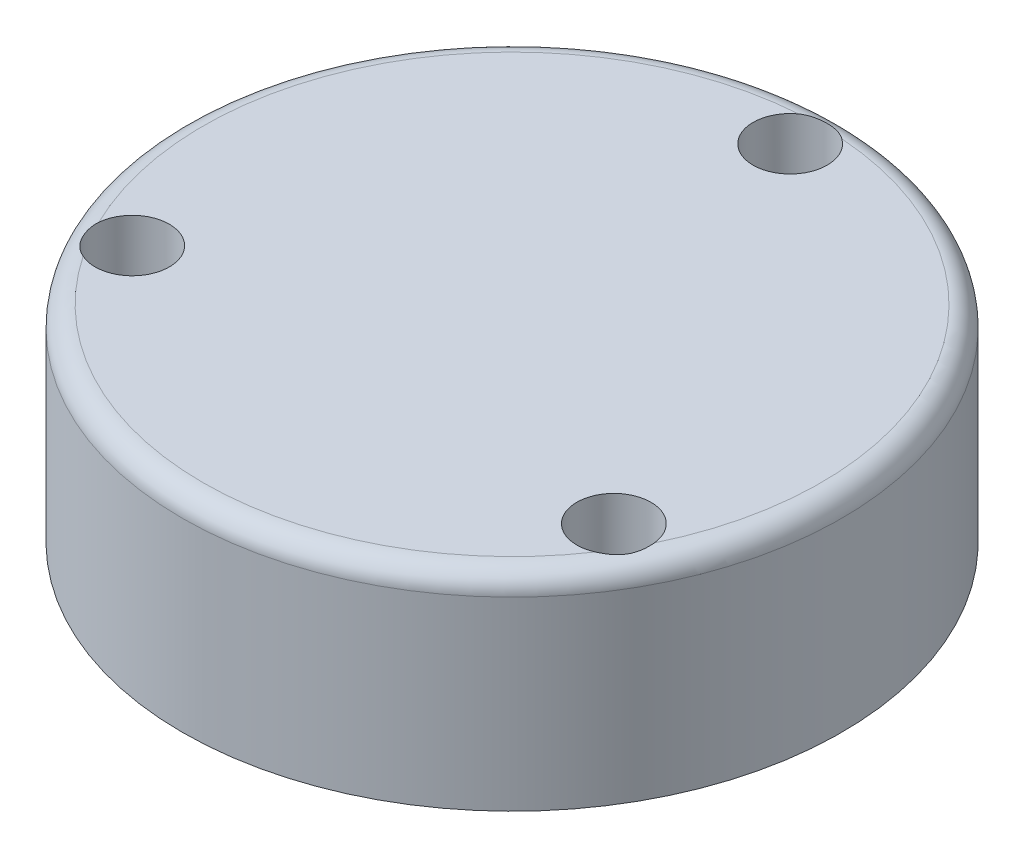
ISO-10303-21;
HEADER;
FILE_DESCRIPTION(('STEP AP214'),'2;1');
FILE_NAME('part.step','',(''),(''),'','','');
FILE_SCHEMA(('AUTOMOTIVE_DESIGN { 1 0 10303 214 1 1 1 1 }'));
ENDSEC;
DATA;
#1=APPLICATION_CONTEXT('core data for automotive mechanical design processes');
#2=APPLICATION_PROTOCOL_DEFINITION('international standard','automotive_design',2000,#1);
#3=PRODUCT_CONTEXT('',#1,'mechanical');
#4=PRODUCT('Part','Part','',(#3));
#5=PRODUCT_RELATED_PRODUCT_CATEGORY('part','',(#4));
#6=PRODUCT_DEFINITION_FORMATION('','',#4);
#7=PRODUCT_DEFINITION_CONTEXT('part definition',#1,'design');
#8=PRODUCT_DEFINITION('design','',#6,#7);
#9=PRODUCT_DEFINITION_SHAPE('','',#8);
#10=(LENGTH_UNIT() NAMED_UNIT(*) SI_UNIT(.MILLI.,.METRE.));
#11=(NAMED_UNIT(*) PLANE_ANGLE_UNIT() SI_UNIT($,.RADIAN.));
#12=(NAMED_UNIT(*) SI_UNIT($,.STERADIAN.) SOLID_ANGLE_UNIT());
#13=UNCERTAINTY_MEASURE_WITH_UNIT(LENGTH_MEASURE(1.E-05),#10,'distance_accuracy_value','');
#14=(GEOMETRIC_REPRESENTATION_CONTEXT(3) GLOBAL_UNCERTAINTY_ASSIGNED_CONTEXT((#13)) GLOBAL_UNIT_ASSIGNED_CONTEXT((#10,
#11,#12)) REPRESENTATION_CONTEXT('',''));
#15=CARTESIAN_POINT('',(0.,0.,0.));
#16=DIRECTION('',(0.,0.,1.));
#17=DIRECTION('',(1.,0.,0.));
#18=AXIS2_PLACEMENT_3D('',#15,#16,#17);
#19=CARTESIAN_POINT('',(0.,10.,0.));
#20=DIRECTION('',(0.,-1.,0.));
#21=DIRECTION('',(0.,0.,-1.));
#22=AXIS2_PLACEMENT_3D('',#19,#20,#21);
#23=CYLINDRICAL_SURFACE('',#22,16.);
#24=CARTESIAN_POINT('',(0.,9.,0.));
#25=DIRECTION('',(0.,1.,0.));
#26=DIRECTION('',(0.,0.,1.));
#27=AXIS2_PLACEMENT_3D('',#24,#25,#26);
#28=CIRCLE('',#27,16.);
#29=CARTESIAN_POINT('',(0.,9.,16.));
#30=VERTEX_POINT('',#29);
#31=EDGE_CURVE('E142',#30,#30,#28,.F.);
#32=ORIENTED_EDGE('',*,*,#31,.T.);
#33=EDGE_LOOP('',(#32));
#34=FACE_BOUND('',#33,.T.);
#35=CARTESIAN_POINT('',(0.,0.,0.));
#36=DIRECTION('',(0.,1.,0.));
#37=DIRECTION('',(0.,0.,1.));
#38=AXIS2_PLACEMENT_3D('',#35,#36,#37);
#39=CIRCLE('',#38,16.);
#40=CARTESIAN_POINT('',(0.,0.,16.));
#41=VERTEX_POINT('',#40);
#42=EDGE_CURVE('E93',#41,#41,#39,.T.);
#43=ORIENTED_EDGE('',*,*,#42,.T.);
#44=EDGE_LOOP('',(#43));
#45=FACE_BOUND('',#44,.T.);
#46=ADVANCED_FACE('F39',(#34,#45),#23,.T.);
#47=CARTESIAN_POINT('',(0.,10.,0.));
#48=DIRECTION('',(0.,1.,0.));
#49=DIRECTION('',(0.,0.,1.));
#50=AXIS2_PLACEMENT_3D('',#47,#48,#49);
#51=PLANE('',#50);
#52=CARTESIAN_POINT('',(11.6913429510908,10.,6.7499999999995));
#53=DIRECTION('',(0.,1.,0.));
#54=DIRECTION('',(0.,0.,1.));
#55=AXIS2_PLACEMENT_3D('',#52,#53,#54);
#56=CIRCLE('',#55,1.8);
#57=CARTESIAN_POINT('',(13.4827106486956,10.,6.57392679937567));
#58=VERTEX_POINT('',#57);
#59=CARTESIAN_POINT('',(12.4345429352275,10.,8.38940653395596));
#60=VERTEX_POINT('',#59);
#61=EDGE_CURVE('E88',#58,#60,#56,.T.);
#62=ORIENTED_EDGE('',*,*,#61,.F.);
#63=CARTESIAN_POINT('',(0.,10.,0.));
#64=DIRECTION('',(0.,1.,0.));
#65=DIRECTION('',(0.,0.,1.));
#66=AXIS2_PLACEMENT_3D('',#63,#64,#65);
#67=CIRCLE('',#66,15.);
#68=CARTESIAN_POINT('',(1.04816771346744,10.,-14.9633333333333));
#69=VERTEX_POINT('',#68);
#70=EDGE_CURVE('E79',#58,#69,#67,.T.);
#71=ORIENTED_EDGE('',*,*,#70,.T.);
#72=CARTESIAN_POINT('',(0.,10.,-13.5));
#73=DIRECTION('',(0.,1.,0.));
#74=DIRECTION('',(0.,0.,1.));
#75=AXIS2_PLACEMENT_3D('',#72,#73,#74);
#76=CIRCLE('',#75,1.8);
#77=CARTESIAN_POINT('',(-1.04816771346744,10.,-14.9633333333333));
#78=VERTEX_POINT('',#77);
#79=EDGE_CURVE('E86',#78,#69,#76,.T.);
#80=ORIENTED_EDGE('',*,*,#79,.F.);
#81=CARTESIAN_POINT('',(0.,10.,0.));
#82=DIRECTION('',(0.,1.,0.));
#83=DIRECTION('',(0.,0.,1.));
#84=AXIS2_PLACEMENT_3D('',#81,#82,#83);
#85=CIRCLE('',#84,15.);
#86=CARTESIAN_POINT('',(-13.4827106486941,10.,6.57392679937878));
#87=VERTEX_POINT('',#86);
#88=EDGE_CURVE('E61',#78,#87,#85,.T.);
#89=ORIENTED_EDGE('',*,*,#88,.T.);
#90=CARTESIAN_POINT('',(-11.6913429510891,10.,6.7500000000005));
#91=DIRECTION('',(0.,1.,0.));
#92=DIRECTION('',(0.,0.,1.));
#93=AXIS2_PLACEMENT_3D('',#90,#91,#92);
#94=CIRCLE('',#93,1.8);
#95=CARTESIAN_POINT('',(-12.4345429352273,10.,8.38940653395627));
#96=VERTEX_POINT('',#95);
#97=EDGE_CURVE('E100',#96,#87,#94,.T.);
#98=ORIENTED_EDGE('',*,*,#97,.F.);
#99=CARTESIAN_POINT('',(0.,10.,0.));
#100=DIRECTION('',(0.,1.,0.));
#101=DIRECTION('',(0.,0.,1.));
#102=AXIS2_PLACEMENT_3D('',#99,#100,#101);
#103=CIRCLE('',#102,15.);
#104=EDGE_CURVE('E98',#96,#60,#103,.T.);
#105=ORIENTED_EDGE('',*,*,#104,.T.);
#106=EDGE_LOOP('',(#62,#71,#80,#89,#98,#105));
#107=FACE_BOUND('',#106,.T.);
#108=ADVANCED_FACE('F85',(#107),#51,.T.);
#109=CARTESIAN_POINT('',(0.,0.,0.));
#110=DIRECTION('',(0.,1.,0.));
#111=DIRECTION('',(0.,0.,1.));
#112=AXIS2_PLACEMENT_3D('',#109,#110,#111);
#113=PLANE('',#112);
#114=CARTESIAN_POINT('',(11.6913429510908,0.,6.7499999999995));
#115=DIRECTION('',(0.,1.,0.));
#116=DIRECTION('',(0.,0.,1.));
#117=AXIS2_PLACEMENT_3D('',#114,#115,#116);
#118=CIRCLE('',#117,2.3);
#119=CARTESIAN_POINT('',(11.6913429510908,0.,9.0499999999995));
#120=VERTEX_POINT('',#119);
#121=EDGE_CURVE('E154',#120,#120,#118,.T.);
#122=ORIENTED_EDGE('',*,*,#121,.T.);
#123=EDGE_LOOP('',(#122));
#124=FACE_BOUND('',#123,.T.);
#125=CARTESIAN_POINT('',(-11.6913429510891,0.,6.7500000000005));
#126=DIRECTION('',(0.,1.,0.));
#127=DIRECTION('',(0.,0.,1.));
#128=AXIS2_PLACEMENT_3D('',#125,#126,#127);
#129=CIRCLE('',#128,2.3);
#130=CARTESIAN_POINT('',(-11.6913429510891,0.,9.0500000000005));
#131=VERTEX_POINT('',#130);
#132=EDGE_CURVE('E150',#131,#131,#129,.T.);
#133=ORIENTED_EDGE('',*,*,#132,.T.);
#134=EDGE_LOOP('',(#133));
#135=FACE_BOUND('',#134,.T.);
#136=CARTESIAN_POINT('',(0.,0.,-13.5));
#137=DIRECTION('',(0.,1.,0.));
#138=DIRECTION('',(0.,0.,1.));
#139=AXIS2_PLACEMENT_3D('',#136,#137,#138);
#140=CIRCLE('',#139,2.3);
#141=CARTESIAN_POINT('',(0.,0.,-11.2));
#142=VERTEX_POINT('',#141);
#143=EDGE_CURVE('E146',#142,#142,#140,.T.);
#144=ORIENTED_EDGE('',*,*,#143,.T.);
#145=EDGE_LOOP('',(#144));
#146=FACE_BOUND('',#145,.T.);
#147=ORIENTED_EDGE('',*,*,#42,.F.);
#148=EDGE_LOOP('',(#147));
#149=FACE_BOUND('',#148,.T.);
#150=ADVANCED_FACE('F172',(#124,#135,#146,#149),#113,.F.);
#151=CARTESIAN_POINT('',(-11.6913429510891,-10.,6.7500000000005));
#152=DIRECTION('',(0.,1.,0.));
#153=DIRECTION('',(0.,0.,1.));
#154=AXIS2_PLACEMENT_3D('',#151,#152,#153);
#155=CYLINDRICAL_SURFACE('',#154,1.8);
#156=CARTESIAN_POINT('',(-11.6913429510891,0.5,6.7500000000005));
#157=DIRECTION('',(0.,1.,0.));
#158=DIRECTION('',(0.,0.,1.));
#159=AXIS2_PLACEMENT_3D('',#156,#157,#158);
#160=CIRCLE('',#159,1.8);
#161=CARTESIAN_POINT('',(-11.6913429510891,0.5,8.5500000000005));
#162=VERTEX_POINT('',#161);
#163=EDGE_CURVE('E48',#162,#162,#160,.F.);
#164=ORIENTED_EDGE('',*,*,#163,.T.);
#165=EDGE_LOOP('',(#164));
#166=FACE_BOUND('',#165,.T.);
#167=ORIENTED_EDGE('',*,*,#97,.T.);
#168=CARTESIAN_POINT('',(-13.4827106486941,10.,6.57392679937878));
#169=CARTESIAN_POINT('',(-13.4868458465572,9.99999399489146,6.61598751611297));
#170=CARTESIAN_POINT('',(-13.4894949659174,9.99926476629978,6.6581699328307));
#171=CARTESIAN_POINT('',(-13.4918221669867,9.99676717443156,6.74256644750295));
#172=CARTESIAN_POINT('',(-13.4915017390024,9.99499933281392,6.78478051893549));
#173=CARTESIAN_POINT('',(-13.486087745997,9.98874215901766,6.9113112478281));
#174=CARTESIAN_POINT('',(-13.4765321908573,9.98330101580457,6.99542112748309));
#175=CARTESIAN_POINT('',(-13.4431710695779,9.97175427896648,7.17517712275386));
#176=CARTESIAN_POINT('',(-13.4172769870169,9.96568692295536,7.27044059959669));
#177=CARTESIAN_POINT('',(-13.3502299187228,9.95696291269872,7.45552302253516));
#178=CARTESIAN_POINT('',(-13.3090927282265,9.9543027405279,7.54534749294431));
#179=CARTESIAN_POINT('',(-13.2121050202064,9.95364380341903,7.71809938113651));
#180=CARTESIAN_POINT('',(-13.1560842339699,9.95570123194611,7.80093134183176));
#181=CARTESIAN_POINT('',(-13.0311282938392,9.96361192900281,7.9561974554788));
#182=CARTESIAN_POINT('',(-12.9621774631152,9.96946982678414,8.02861879593357));
#183=CARTESIAN_POINT('',(-12.8540395495157,9.97852935475604,8.12484200304856));
#184=CARTESIAN_POINT('',(-12.819131042773,9.98143709052227,8.15361737200082));
#185=CARTESIAN_POINT('',(-12.7472323891364,9.98700956848065,8.20847145388258));
#186=CARTESIAN_POINT('',(-12.710242630721,9.98967435577891,8.23455066750451));
#187=CARTESIAN_POINT('',(-12.6344293138735,9.9943320650311,8.28382816467417));
#188=CARTESIAN_POINT('',(-12.595608593786,9.99632599029529,8.30703071730513));
#189=CARTESIAN_POINT('',(-12.516281343911,9.99915584368471,8.35047675017804));
#190=CARTESIAN_POINT('',(-12.4757739615395,9.99999117865637,8.37071870997049));
#191=CARTESIAN_POINT('',(-12.4345429352273,10.,8.38940653395627));
#192=B_SPLINE_CURVE_WITH_KNOTS('',3,(#168,#169,#170,#171,#172,#173,#174,#175,#176,#177,#178,
#179,#180,#181,#182,#183,#184,#185,#186,#187,#188,#189,#190,#191),.UNSPECIFIED.,.F.,.F.,(4,2,2,
2,2,2,2,2,2,2,2,4),(0.,0.12671706808754,0.253370544980113,0.506962010882945,0.802336996459562,
1.09740676016939,1.39600946244021,1.69497656943448,1.83087695128169,1.96675205009532,
2.10242302761193,2.23816343783218),.UNSPECIFIED.);
#193=EDGE_CURVE('E54',#87,#96,#192,.T.);
#194=ORIENTED_EDGE('',*,*,#193,.T.);
#195=EDGE_LOOP('',(#167,#194));
#196=FACE_BOUND('',#195,.T.);
#197=ADVANCED_FACE('F131',(#166,#196),#155,.F.);
#198=CARTESIAN_POINT('',(11.6913429510908,-10.,6.7499999999995));
#199=DIRECTION('',(0.,1.,0.));
#200=DIRECTION('',(0.,0.,1.));
#201=AXIS2_PLACEMENT_3D('',#198,#199,#200);
#202=CYLINDRICAL_SURFACE('',#201,1.8);
#203=CARTESIAN_POINT('',(11.6913429510908,0.5,6.7499999999995));
#204=DIRECTION('',(0.,1.,0.));
#205=DIRECTION('',(0.,0.,1.));
#206=AXIS2_PLACEMENT_3D('',#203,#204,#205);
#207=CIRCLE('',#206,1.8);
#208=CARTESIAN_POINT('',(11.6913429510908,0.5,8.5499999999995));
#209=VERTEX_POINT('',#208);
#210=EDGE_CURVE('E158',#209,#209,#207,.F.);
#211=ORIENTED_EDGE('',*,*,#210,.T.);
#212=EDGE_LOOP('',(#211));
#213=FACE_BOUND('',#212,.T.);
#214=ORIENTED_EDGE('',*,*,#61,.T.);
#215=CARTESIAN_POINT('',(12.4345429352275,10.,8.38940653395596));
#216=CARTESIAN_POINT('',(12.4730361833523,9.99999399489146,8.37195736198799));
#217=CARTESIAN_POINT('',(12.510891787503,9.99926476629978,8.3531603582928));
#218=CARTESIAN_POINT('',(12.5851449137347,9.99676717443155,8.31297751620247));
#219=CARTESIAN_POINT('',(12.6215431580004,9.99499933281391,8.29159298171179));
#220=CARTESIAN_POINT('',(12.728414987078,9.98874215901762,8.22363896178692));
#221=CARTESIAN_POINT('',(12.7964785019987,9.98330101580451,8.17330866846126));
#222=CARTESIAN_POINT('',(12.9354711997462,9.97175427896636,8.05453909229934));
#223=CARTESIAN_POINT('',(13.0050247494645,9.9656869229552,7.98448242057251));
#224=CARTESIAN_POINT('',(13.1317872953762,9.95696291269848,7.83387674471153));
#225=CARTESIAN_POINT('',(13.189008973384,9.95430274052763,7.7533386574969));
#226=CARTESIAN_POINT('',(13.2901226431003,9.95364380341869,7.58296889440072));
#227=CARTESIAN_POINT('',(13.3338468321895,9.95570123194575,7.49303749003236));
#228=CARTESIAN_POINT('',(13.4058332608896,9.96361192900243,7.30718941470194));
#229=CARTESIAN_POINT('',(13.4340765661376,9.96946982678377,7.21126557345557));
#230=CARTESIAN_POINT('',(13.4633393511333,9.97852935475572,7.0695037896084));
#231=CARTESIAN_POINT('',(13.470805298278,9.98143709052199,7.02488445148456));
#232=CARTESIAN_POINT('',(13.4823609998707,9.98700956848044,6.93519134999586));
#233=CARTESIAN_POINT('',(13.4864513821704,9.98967435577874,6.89011767271703));
#234=CARTESIAN_POINT('',(13.4912202881305,9.994332065031,6.79982266579637));
#235=CARTESIAN_POINT('',(13.4919039280978,9.99632599029523,6.75460165969166));
#236=CARTESIAN_POINT('',(13.4898656713218,9.99915584368469,6.66417922965036));
#237=CARTESIAN_POINT('',(13.4871420315386,9.99999117865637,6.61897782757929));
#238=CARTESIAN_POINT('',(13.4827106486956,10.,6.57392679937566));
#239=B_SPLINE_CURVE_WITH_KNOTS('',3,(#215,#216,#217,#218,#219,#220,#221,#222,#223,#224,#225,
#226,#227,#228,#229,#230,#231,#232,#233,#234,#235,#236,#237,#238),.UNSPECIFIED.,.F.,.F.,(4,2,2,
2,2,2,2,2,2,2,2,4),(0.,0.126717068087543,0.253370544980115,0.50696201088295,0.802336996459494,
1.09740676016925,1.39600946244006,1.69497656943434,1.83087695128254,1.96675205009716,
2.10242302761476,2.23816343783599),.UNSPECIFIED.);
#240=EDGE_CURVE('E135',#60,#58,#239,.T.);
#241=ORIENTED_EDGE('',*,*,#240,.T.);
#242=EDGE_LOOP('',(#214,#241));
#243=FACE_BOUND('',#242,.T.);
#244=ADVANCED_FACE('F127',(#213,#243),#202,.F.);
#245=CARTESIAN_POINT('',(0.,-10.,-13.5));
#246=DIRECTION('',(0.,1.,0.));
#247=DIRECTION('',(0.,0.,1.));
#248=AXIS2_PLACEMENT_3D('',#245,#246,#247);
#249=CYLINDRICAL_SURFACE('',#248,1.8);
#250=CARTESIAN_POINT('',(0.,0.5,-13.5));
#251=DIRECTION('',(0.,1.,0.));
#252=DIRECTION('',(0.,0.,1.));
#253=AXIS2_PLACEMENT_3D('',#250,#251,#252);
#254=CIRCLE('',#253,1.8);
#255=CARTESIAN_POINT('',(0.,0.5,-11.7));
#256=VERTEX_POINT('',#255);
#257=EDGE_CURVE('E11',#256,#256,#254,.F.);
#258=ORIENTED_EDGE('',*,*,#257,.T.);
#259=EDGE_LOOP('',(#258));
#260=FACE_BOUND('',#259,.T.);
#261=ORIENTED_EDGE('',*,*,#79,.T.);
#262=CARTESIAN_POINT('',(1.04816771346744,10.,-14.9633333333333));
#263=CARTESIAN_POINT('',(1.01380966320579,9.99999399489146,-14.9879448780995));
#264=CARTESIAN_POINT('',(0.978603178415354,9.99926476629978,-15.0113302911221));
#265=CARTESIAN_POINT('',(0.90667725325299,9.99676717443156,-15.0555439637039));
#266=CARTESIAN_POINT('',(0.869958581003122,9.99499933281392,-15.0763735006458));
#267=CARTESIAN_POINT('',(0.757672758920047,9.98874215901764,-15.1349502096135));
#268=CARTESIAN_POINT('',(0.680053688859749,9.98330101580454,-15.1687297959428));
#269=CARTESIAN_POINT('',(0.507699869833047,9.97175427896642,-15.2297162150516));
#270=CARTESIAN_POINT('',(0.412252237553865,9.96568692295528,-15.2549230201675));
#271=CARTESIAN_POINT('',(0.218442623348189,9.9569629126986,-15.2893997672449));
#272=CARTESIAN_POINT('',(0.120083754844236,9.95430274052776,-15.2986861504394));
#273=CARTESIAN_POINT('',(-0.0780176228919627,9.95364380341886,-15.3010682755355));
#274=CARTESIAN_POINT('',(-0.177762598217576,9.95570123194593,-15.2939688318624));
#275=CARTESIAN_POINT('',(-0.374704967048184,9.96361192900262,-15.263386870179));
#276=CARTESIAN_POINT('',(-0.471899103020141,9.96946982678395,-15.2398843693875));
#277=CARTESIAN_POINT('',(-0.609299801615252,9.97852935475588,-15.1943457926556));
#278=CARTESIAN_POINT('',(-0.651674255502718,9.98143709052213,-15.1785018234843));
#279=CARTESIAN_POINT('',(-0.735128610732197,9.98700956848054,-15.1436628038779));
#280=CARTESIAN_POINT('',(-0.776208751447341,9.98967435577882,-15.1246683402213));
#281=CARTESIAN_POINT('',(-0.856790974255274,9.99433206503105,-15.0836508304708));
#282=CARTESIAN_POINT('',(-0.89629533431018,9.99632599029526,-15.0616323769973));
#283=CARTESIAN_POINT('',(-0.973584327409595,9.9991558436847,-15.0146559798294));
#284=CARTESIAN_POINT('',(-1.01136806999812,9.99999117865637,-14.989696537551));
#285=CARTESIAN_POINT('',(-1.04816771346744,10.,-14.9633333333333));
#286=B_SPLINE_CURVE_WITH_KNOTS('',3,(#262,#263,#264,#265,#266,#267,#268,#269,#270,#271,#272,
#273,#274,#275,#276,#277,#278,#279,#280,#281,#282,#283,#284,#285),.UNSPECIFIED.,.F.,.F.,(4,2,2,
2,2,2,2,2,2,2,2,4),(0.,0.126717068087542,0.253370544980116,0.50696201088295,0.802336996459529,
1.09740676016932,1.39600946244014,1.69497656943441,1.83087695128212,1.96675205009624,
2.10242302761335,2.23816343783409),.UNSPECIFIED.);
#287=EDGE_CURVE('E75',#69,#78,#286,.T.);
#288=ORIENTED_EDGE('',*,*,#287,.T.);
#289=EDGE_LOOP('',(#261,#288));
#290=FACE_BOUND('',#289,.T.);
#291=ADVANCED_FACE('F91',(#260,#290),#249,.F.);
#292=CARTESIAN_POINT('',(0.,9.,0.));
#293=DIRECTION('',(0.,1.,0.));
#294=DIRECTION('',(0.,0.,1.));
#295=AXIS2_PLACEMENT_3D('',#292,#293,#294);
#296=TOROIDAL_SURFACE('',#295,15.,1.);
#297=ORIENTED_EDGE('',*,*,#31,.F.);
#298=EDGE_LOOP('',(#297));
#299=FACE_BOUND('',#298,.T.);
#300=ORIENTED_EDGE('',*,*,#287,.F.);
#301=ORIENTED_EDGE('',*,*,#70,.F.);
#302=ORIENTED_EDGE('',*,*,#240,.F.);
#303=ORIENTED_EDGE('',*,*,#104,.F.);
#304=ORIENTED_EDGE('',*,*,#193,.F.);
#305=ORIENTED_EDGE('',*,*,#88,.F.);
#306=EDGE_LOOP('',(#300,#301,#302,#303,#304,#305));
#307=FACE_BOUND('',#306,.T.);
#308=ADVANCED_FACE('F77',(#299,#307),#296,.T.);
#309=CARTESIAN_POINT('',(11.6913429510908,0.5,6.7499999999995));
#310=DIRECTION('',(0.,1.,0.));
#311=DIRECTION('',(0.,0.,1.));
#312=AXIS2_PLACEMENT_3D('',#309,#310,#311);
#313=TOROIDAL_SURFACE('',#312,2.3,0.5);
#314=ORIENTED_EDGE('',*,*,#210,.F.);
#315=EDGE_LOOP('',(#314));
#316=FACE_BOUND('',#315,.T.);
#317=ORIENTED_EDGE('',*,*,#121,.F.);
#318=EDGE_LOOP('',(#317));
#319=FACE_BOUND('',#318,.T.);
#320=ADVANCED_FACE('F169',(#316,#319),#313,.T.);
#321=CARTESIAN_POINT('',(-11.6913429510891,0.5,6.7500000000005));
#322=DIRECTION('',(0.,1.,0.));
#323=DIRECTION('',(0.,0.,1.));
#324=AXIS2_PLACEMENT_3D('',#321,#322,#323);
#325=TOROIDAL_SURFACE('',#324,2.3,0.5);
#326=ORIENTED_EDGE('',*,*,#163,.F.);
#327=EDGE_LOOP('',(#326));
#328=FACE_BOUND('',#327,.T.);
#329=ORIENTED_EDGE('',*,*,#132,.F.);
#330=EDGE_LOOP('',(#329));
#331=FACE_BOUND('',#330,.T.);
#332=ADVANCED_FACE('F166',(#328,#331),#325,.T.);
#333=CARTESIAN_POINT('',(0.,0.5,-13.5));
#334=DIRECTION('',(0.,1.,0.));
#335=DIRECTION('',(0.,0.,1.));
#336=AXIS2_PLACEMENT_3D('',#333,#334,#335);
#337=TOROIDAL_SURFACE('',#336,2.3,0.5);
#338=ORIENTED_EDGE('',*,*,#257,.F.);
#339=EDGE_LOOP('',(#338));
#340=FACE_BOUND('',#339,.T.);
#341=ORIENTED_EDGE('',*,*,#143,.F.);
#342=EDGE_LOOP('',(#341));
#343=FACE_BOUND('',#342,.T.);
#344=ADVANCED_FACE('F41',(#340,#343),#337,.T.);
#345=CLOSED_SHELL('',(#46,#108,#150,#197,#244,#291,#308,#320,#332,#344));
#346=MANIFOLD_SOLID_BREP('B2',#345);
#347=ADVANCED_BREP_SHAPE_REPRESENTATION('',(#18,#346),#14);
#348=SHAPE_DEFINITION_REPRESENTATION(#9,#347);
ENDSEC;
END-ISO-10303-21;
